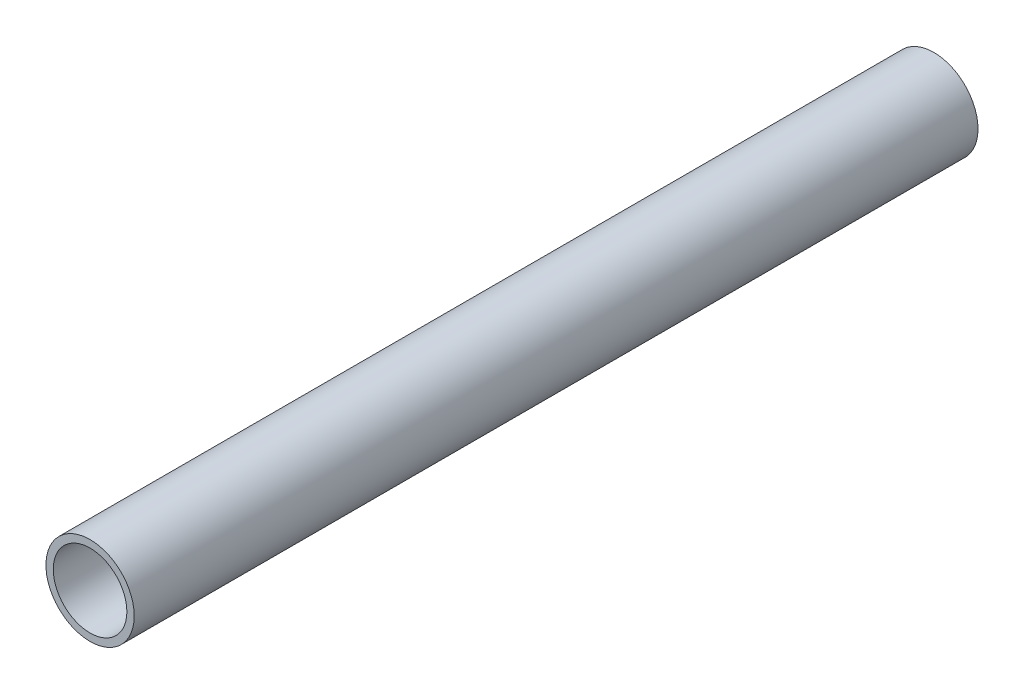
ISO-10303-21;
HEADER;
FILE_DESCRIPTION(('STEP AP214'),'2;1');
FILE_NAME('part.step','',(''),(''),'','','');
FILE_SCHEMA(('AUTOMOTIVE_DESIGN { 1 0 10303 214 1 1 1 1 }'));
ENDSEC;
DATA;
#1=APPLICATION_CONTEXT('core data for automotive mechanical design processes');
#2=APPLICATION_PROTOCOL_DEFINITION('international standard','automotive_design',2000,#1);
#3=PRODUCT_CONTEXT('',#1,'mechanical');
#4=PRODUCT('Part','Part','',(#3));
#5=PRODUCT_RELATED_PRODUCT_CATEGORY('part','',(#4));
#6=PRODUCT_DEFINITION_FORMATION('','',#4);
#7=PRODUCT_DEFINITION_CONTEXT('part definition',#1,'design');
#8=PRODUCT_DEFINITION('design','',#6,#7);
#9=PRODUCT_DEFINITION_SHAPE('','',#8);
#10=(LENGTH_UNIT() NAMED_UNIT(*) SI_UNIT(.MILLI.,.METRE.));
#11=(NAMED_UNIT(*) PLANE_ANGLE_UNIT() SI_UNIT($,.RADIAN.));
#12=(NAMED_UNIT(*) SI_UNIT($,.STERADIAN.) SOLID_ANGLE_UNIT());
#13=UNCERTAINTY_MEASURE_WITH_UNIT(LENGTH_MEASURE(1.E-05),#10,'distance_accuracy_value','');
#14=(GEOMETRIC_REPRESENTATION_CONTEXT(3) GLOBAL_UNCERTAINTY_ASSIGNED_CONTEXT((#13)) GLOBAL_UNIT_ASSIGNED_CONTEXT((#10,
#11,#12)) REPRESENTATION_CONTEXT('',''));
#15=CARTESIAN_POINT('',(0.,0.,0.));
#16=DIRECTION('',(0.,0.,1.));
#17=DIRECTION('',(1.,0.,0.));
#18=AXIS2_PLACEMENT_3D('',#15,#16,#17);
#19=CARTESIAN_POINT('',(0.,0.,172.));
#20=DIRECTION('',(0.,0.,1.));
#21=DIRECTION('',(1.,0.,0.));
#22=AXIS2_PLACEMENT_3D('',#19,#20,#21);
#23=PLANE('',#22);
#24=CARTESIAN_POINT('',(0.,0.,172.));
#25=DIRECTION('',(0.,0.,1.));
#26=DIRECTION('',(1.,0.,0.));
#27=AXIS2_PLACEMENT_3D('',#24,#25,#26);
#28=CIRCLE('',#27,9.);
#29=CARTESIAN_POINT('',(9.,0.,172.));
#30=VERTEX_POINT('',#29);
#31=EDGE_CURVE('E10',#30,#30,#28,.T.);
#32=ORIENTED_EDGE('',*,*,#31,.T.);
#33=EDGE_LOOP('',(#32));
#34=FACE_BOUND('',#33,.T.);
#35=CARTESIAN_POINT('',(0.,0.,172.));
#36=DIRECTION('',(0.,0.,1.));
#37=DIRECTION('',(1.,0.,0.));
#38=AXIS2_PLACEMENT_3D('',#35,#36,#37);
#39=CIRCLE('',#38,7.5);
#40=CARTESIAN_POINT('',(7.5,0.,172.));
#41=VERTEX_POINT('',#40);
#42=EDGE_CURVE('E42',#41,#41,#39,.T.);
#43=ORIENTED_EDGE('',*,*,#42,.F.);
#44=EDGE_LOOP('',(#43));
#45=FACE_BOUND('',#44,.T.);
#46=ADVANCED_FACE('F31',(#34,#45),#23,.T.);
#47=CARTESIAN_POINT('',(0.,0.,0.));
#48=DIRECTION('',(0.,0.,1.));
#49=DIRECTION('',(1.,0.,0.));
#50=AXIS2_PLACEMENT_3D('',#47,#48,#49);
#51=PLANE('',#50);
#52=CARTESIAN_POINT('',(0.,0.,0.));
#53=DIRECTION('',(0.,0.,1.));
#54=DIRECTION('',(1.,0.,0.));
#55=AXIS2_PLACEMENT_3D('',#52,#53,#54);
#56=CIRCLE('',#55,9.);
#57=CARTESIAN_POINT('',(9.,0.,0.));
#58=VERTEX_POINT('',#57);
#59=EDGE_CURVE('E35',#58,#58,#56,.T.);
#60=ORIENTED_EDGE('',*,*,#59,.F.);
#61=EDGE_LOOP('',(#60));
#62=FACE_BOUND('',#61,.T.);
#63=CARTESIAN_POINT('',(0.,0.,0.));
#64=DIRECTION('',(0.,0.,1.));
#65=DIRECTION('',(1.,0.,0.));
#66=AXIS2_PLACEMENT_3D('',#63,#64,#65);
#67=CIRCLE('',#66,7.5);
#68=CARTESIAN_POINT('',(7.5,0.,0.));
#69=VERTEX_POINT('',#68);
#70=EDGE_CURVE('E44',#69,#69,#67,.T.);
#71=ORIENTED_EDGE('',*,*,#70,.T.);
#72=EDGE_LOOP('',(#71));
#73=FACE_BOUND('',#72,.T.);
#74=ADVANCED_FACE('F54',(#62,#73),#51,.F.);
#75=CARTESIAN_POINT('',(0.,0.,172.));
#76=DIRECTION('',(0.,0.,-1.));
#77=DIRECTION('',(-1.,0.,0.));
#78=AXIS2_PLACEMENT_3D('',#75,#76,#77);
#79=CYLINDRICAL_SURFACE('',#78,9.);
#80=ORIENTED_EDGE('',*,*,#31,.F.);
#81=EDGE_LOOP('',(#80));
#82=FACE_BOUND('',#81,.T.);
#83=ORIENTED_EDGE('',*,*,#59,.T.);
#84=EDGE_LOOP('',(#83));
#85=FACE_BOUND('',#84,.T.);
#86=ADVANCED_FACE('F33',(#82,#85),#79,.T.);
#87=CARTESIAN_POINT('',(0.,0.,172.));
#88=DIRECTION('',(0.,0.,-1.));
#89=DIRECTION('',(-1.,0.,0.));
#90=AXIS2_PLACEMENT_3D('',#87,#88,#89);
#91=CYLINDRICAL_SURFACE('',#90,7.5);
#92=ORIENTED_EDGE('',*,*,#42,.T.);
#93=EDGE_LOOP('',(#92));
#94=FACE_BOUND('',#93,.T.);
#95=ORIENTED_EDGE('',*,*,#70,.F.);
#96=EDGE_LOOP('',(#95));
#97=FACE_BOUND('',#96,.T.);
#98=ADVANCED_FACE('F50',(#94,#97),#91,.F.);
#99=CLOSED_SHELL('',(#46,#74,#86,#98));
#100=MANIFOLD_SOLID_BREP('B2',#99);
#101=ADVANCED_BREP_SHAPE_REPRESENTATION('',(#18,#100),#14);
#102=SHAPE_DEFINITION_REPRESENTATION(#9,#101);
ENDSEC;
END-ISO-10303-21;
